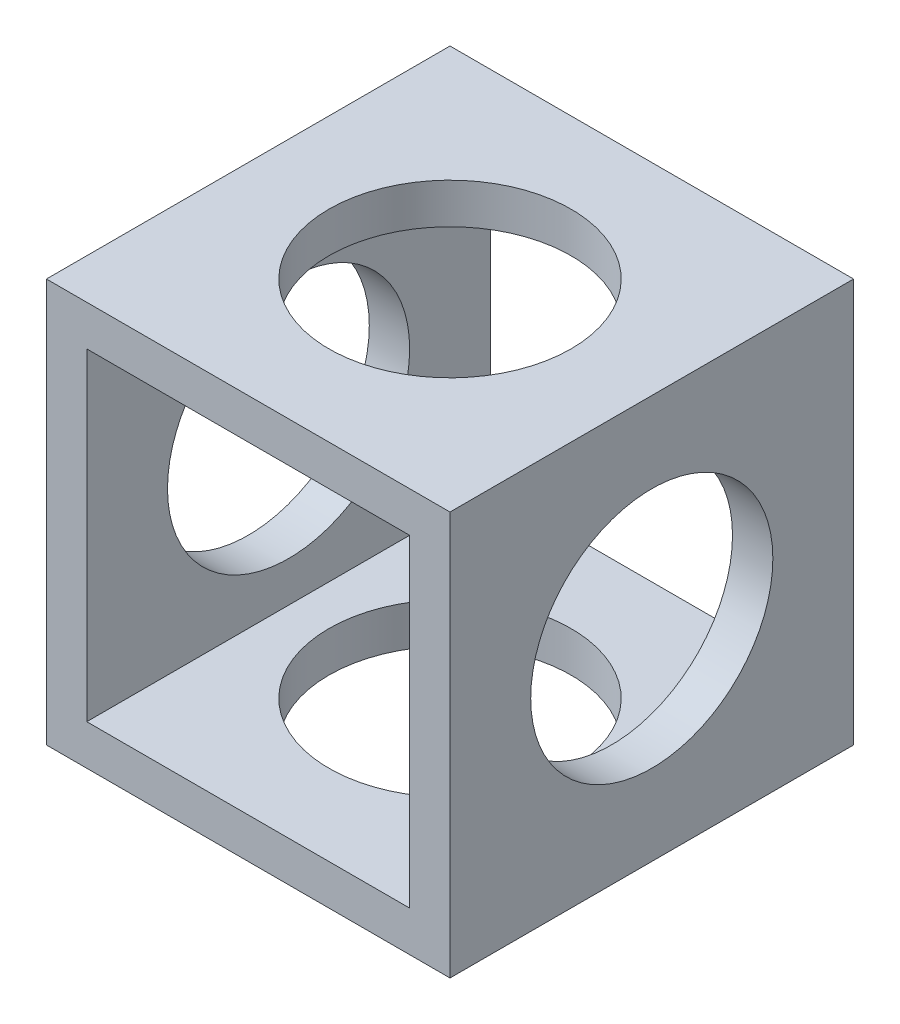
ISO-10303-21;
HEADER;
FILE_DESCRIPTION(('STEP AP214'),'2;1');
FILE_NAME('part.step','',(''),(''),'','','');
FILE_SCHEMA(('AUTOMOTIVE_DESIGN { 1 0 10303 214 1 1 1 1 }'));
ENDSEC;
DATA;
#1=APPLICATION_CONTEXT('core data for automotive mechanical design processes');
#2=APPLICATION_PROTOCOL_DEFINITION('international standard','automotive_design',2000,#1);
#3=PRODUCT_CONTEXT('',#1,'mechanical');
#4=PRODUCT('Part','Part','',(#3));
#5=PRODUCT_RELATED_PRODUCT_CATEGORY('part','',(#4));
#6=PRODUCT_DEFINITION_FORMATION('','',#4);
#7=PRODUCT_DEFINITION_CONTEXT('part definition',#1,'design');
#8=PRODUCT_DEFINITION('design','',#6,#7);
#9=PRODUCT_DEFINITION_SHAPE('','',#8);
#10=(LENGTH_UNIT() NAMED_UNIT(*) SI_UNIT(.MILLI.,.METRE.));
#11=(NAMED_UNIT(*) PLANE_ANGLE_UNIT() SI_UNIT($,.RADIAN.));
#12=(NAMED_UNIT(*) SI_UNIT($,.STERADIAN.) SOLID_ANGLE_UNIT());
#13=UNCERTAINTY_MEASURE_WITH_UNIT(LENGTH_MEASURE(1.E-05),#10,'distance_accuracy_value','');
#14=(GEOMETRIC_REPRESENTATION_CONTEXT(3) GLOBAL_UNCERTAINTY_ASSIGNED_CONTEXT((#13)) GLOBAL_UNIT_ASSIGNED_CONTEXT((#10,
#11,#12)) REPRESENTATION_CONTEXT('',''));
#15=CARTESIAN_POINT('',(0.,0.,0.));
#16=DIRECTION('',(0.,0.,1.));
#17=DIRECTION('',(1.,0.,0.));
#18=AXIS2_PLACEMENT_3D('',#15,#16,#17);
#19=CARTESIAN_POINT('',(-25.,-25.,-50.));
#20=DIRECTION('',(-1.,0.,0.));
#21=DIRECTION('',(0.,0.,1.));
#22=AXIS2_PLACEMENT_3D('',#19,#20,#21);
#23=PLANE('',#22);
#24=CARTESIAN_POINT('',(-25.,0.,-25.));
#25=DIRECTION('',(1.,0.,0.));
#26=DIRECTION('',(0.,0.,-1.));
#27=AXIS2_PLACEMENT_3D('',#24,#25,#26);
#28=CIRCLE('',#27,15.);
#29=CARTESIAN_POINT('',(-25.,0.,-40.));
#30=VERTEX_POINT('',#29);
#31=EDGE_CURVE('E220',#30,#30,#28,.T.);
#32=ORIENTED_EDGE('',*,*,#31,.T.);
#33=EDGE_LOOP('',(#32));
#34=FACE_BOUND('',#33,.T.);
#35=DIRECTION('',(0.,-1.,0.));
#36=VECTOR('',#35,1.);
#37=CARTESIAN_POINT('',(-25.,-25.,0.));
#38=LINE('',#37,#36);
#39=CARTESIAN_POINT('',(-25.,25.,0.));
#40=VERTEX_POINT('',#39);
#41=CARTESIAN_POINT('',(-25.,-25.,0.));
#42=VERTEX_POINT('',#41);
#43=EDGE_CURVE('E151',#40,#42,#38,.T.);
#44=ORIENTED_EDGE('',*,*,#43,.F.);
#45=DIRECTION('',(0.,0.,1.));
#46=VECTOR('',#45,1.);
#47=CARTESIAN_POINT('',(-25.,25.,-50.));
#48=LINE('',#47,#46);
#49=CARTESIAN_POINT('',(-25.,25.,-50.));
#50=VERTEX_POINT('',#49);
#51=EDGE_CURVE('E11',#50,#40,#48,.T.);
#52=ORIENTED_EDGE('',*,*,#51,.F.);
#53=DIRECTION('',(0.,-1.,0.));
#54=VECTOR('',#53,1.);
#55=CARTESIAN_POINT('',(-25.,-25.,-50.));
#56=LINE('',#55,#54);
#57=CARTESIAN_POINT('',(-25.,-25.,-50.));
#58=VERTEX_POINT('',#57);
#59=EDGE_CURVE('E157',#50,#58,#56,.T.);
#60=ORIENTED_EDGE('',*,*,#59,.T.);
#61=DIRECTION('',(0.,0.,1.));
#62=VECTOR('',#61,1.);
#63=CARTESIAN_POINT('',(-25.,-25.,-50.));
#64=LINE('',#63,#62);
#65=EDGE_CURVE('E174',#58,#42,#64,.T.);
#66=ORIENTED_EDGE('',*,*,#65,.T.);
#67=EDGE_LOOP('',(#44,#52,#60,#66));
#68=FACE_BOUND('',#67,.T.);
#69=ADVANCED_FACE('F39',(#34,#68),#23,.T.);
#70=CARTESIAN_POINT('',(25.,25.,-50.));
#71=DIRECTION('',(0.,1.,0.));
#72=DIRECTION('',(-1.,0.,0.));
#73=AXIS2_PLACEMENT_3D('',#70,#71,#72);
#74=PLANE('',#73);
#75=CARTESIAN_POINT('',(0.,25.,-25.));
#76=DIRECTION('',(0.,1.,0.));
#77=DIRECTION('',(-1.,0.,0.));
#78=AXIS2_PLACEMENT_3D('',#75,#76,#77);
#79=CIRCLE('',#78,15.);
#80=CARTESIAN_POINT('',(-15.,25.,-25.));
#81=VERTEX_POINT('',#80);
#82=EDGE_CURVE('E205',#81,#81,#79,.T.);
#83=ORIENTED_EDGE('',*,*,#82,.F.);
#84=EDGE_LOOP('',(#83));
#85=FACE_BOUND('',#84,.T.);
#86=DIRECTION('',(-1.,0.,0.));
#87=VECTOR('',#86,1.);
#88=CARTESIAN_POINT('',(25.,25.,0.));
#89=LINE('',#88,#87);
#90=CARTESIAN_POINT('',(25.,25.,0.));
#91=VERTEX_POINT('',#90);
#92=EDGE_CURVE('E162',#91,#40,#89,.T.);
#93=ORIENTED_EDGE('',*,*,#92,.F.);
#94=DIRECTION('',(0.,0.,1.));
#95=VECTOR('',#94,1.);
#96=CARTESIAN_POINT('',(25.,25.,-50.));
#97=LINE('',#96,#95);
#98=CARTESIAN_POINT('',(25.,25.,-50.));
#99=VERTEX_POINT('',#98);
#100=EDGE_CURVE('E48',#99,#91,#97,.T.);
#101=ORIENTED_EDGE('',*,*,#100,.F.);
#102=DIRECTION('',(-1.,0.,0.));
#103=VECTOR('',#102,1.);
#104=CARTESIAN_POINT('',(25.,25.,-50.));
#105=LINE('',#104,#103);
#106=EDGE_CURVE('E170',#99,#50,#105,.T.);
#107=ORIENTED_EDGE('',*,*,#106,.T.);
#108=ORIENTED_EDGE('',*,*,#51,.T.);
#109=EDGE_LOOP('',(#93,#101,#107,#108));
#110=FACE_BOUND('',#109,.T.);
#111=ADVANCED_FACE('F246',(#85,#110),#74,.T.);
#112=CARTESIAN_POINT('',(25.,-25.,-50.));
#113=DIRECTION('',(1.,0.,0.));
#114=DIRECTION('',(0.,0.,-1.));
#115=AXIS2_PLACEMENT_3D('',#112,#113,#114);
#116=PLANE('',#115);
#117=CARTESIAN_POINT('',(25.,0.,-25.));
#118=DIRECTION('',(1.,0.,0.));
#119=DIRECTION('',(0.,0.,-1.));
#120=AXIS2_PLACEMENT_3D('',#117,#118,#119);
#121=CIRCLE('',#120,15.);
#122=CARTESIAN_POINT('',(25.,0.,-40.));
#123=VERTEX_POINT('',#122);
#124=EDGE_CURVE('E216',#123,#123,#121,.T.);
#125=ORIENTED_EDGE('',*,*,#124,.F.);
#126=EDGE_LOOP('',(#125));
#127=FACE_BOUND('',#126,.T.);
#128=DIRECTION('',(0.,1.,0.));
#129=VECTOR('',#128,1.);
#130=CARTESIAN_POINT('',(25.,-25.,0.));
#131=LINE('',#130,#129);
#132=CARTESIAN_POINT('',(25.,-25.,0.));
#133=VERTEX_POINT('',#132);
#134=EDGE_CURVE('E182',#133,#91,#131,.T.);
#135=ORIENTED_EDGE('',*,*,#134,.F.);
#136=DIRECTION('',(0.,0.,1.));
#137=VECTOR('',#136,1.);
#138=CARTESIAN_POINT('',(25.,-25.,-50.));
#139=LINE('',#138,#137);
#140=CARTESIAN_POINT('',(25.,-25.,-50.));
#141=VERTEX_POINT('',#140);
#142=EDGE_CURVE('E191',#141,#133,#139,.T.);
#143=ORIENTED_EDGE('',*,*,#142,.F.);
#144=DIRECTION('',(0.,1.,0.));
#145=VECTOR('',#144,1.);
#146=CARTESIAN_POINT('',(25.,-25.,-50.));
#147=LINE('',#146,#145);
#148=EDGE_CURVE('E166',#141,#99,#147,.T.);
#149=ORIENTED_EDGE('',*,*,#148,.T.);
#150=ORIENTED_EDGE('',*,*,#100,.T.);
#151=EDGE_LOOP('',(#135,#143,#149,#150));
#152=FACE_BOUND('',#151,.T.);
#153=ADVANCED_FACE('F250',(#127,#152),#116,.T.);
#154=CARTESIAN_POINT('',(25.,-25.,-50.));
#155=DIRECTION('',(0.,-1.,0.));
#156=DIRECTION('',(1.,0.,0.));
#157=AXIS2_PLACEMENT_3D('',#154,#155,#156);
#158=PLANE('',#157);
#159=CARTESIAN_POINT('',(0.,-25.,-25.));
#160=DIRECTION('',(0.,1.,0.));
#161=DIRECTION('',(-1.,0.,0.));
#162=AXIS2_PLACEMENT_3D('',#159,#160,#161);
#163=CIRCLE('',#162,15.);
#164=CARTESIAN_POINT('',(-15.,-25.,-25.));
#165=VERTEX_POINT('',#164);
#166=EDGE_CURVE('E198',#165,#165,#163,.T.);
#167=ORIENTED_EDGE('',*,*,#166,.T.);
#168=EDGE_LOOP('',(#167));
#169=FACE_BOUND('',#168,.T.);
#170=DIRECTION('',(1.,0.,0.));
#171=VECTOR('',#170,1.);
#172=CARTESIAN_POINT('',(25.,-25.,0.));
#173=LINE('',#172,#171);
#174=EDGE_CURVE('E178',#42,#133,#173,.T.);
#175=ORIENTED_EDGE('',*,*,#174,.F.);
#176=ORIENTED_EDGE('',*,*,#65,.F.);
#177=DIRECTION('',(1.,0.,0.));
#178=VECTOR('',#177,1.);
#179=CARTESIAN_POINT('',(25.,-25.,-50.));
#180=LINE('',#179,#178);
#181=EDGE_CURVE('E161',#58,#141,#180,.T.);
#182=ORIENTED_EDGE('',*,*,#181,.T.);
#183=ORIENTED_EDGE('',*,*,#142,.T.);
#184=EDGE_LOOP('',(#175,#176,#182,#183));
#185=FACE_BOUND('',#184,.T.);
#186=ADVANCED_FACE('F266',(#169,#185),#158,.T.);
#187=CARTESIAN_POINT('',(0.,0.,-50.));
#188=DIRECTION('',(0.,0.,1.));
#189=DIRECTION('',(1.,0.,0.));
#190=AXIS2_PLACEMENT_3D('',#187,#188,#189);
#191=PLANE('',#190);
#192=DIRECTION('',(-1.,0.,0.));
#193=VECTOR('',#192,1.);
#194=CARTESIAN_POINT('',(20.,20.,-50.));
#195=LINE('',#194,#193);
#196=CARTESIAN_POINT('',(20.,20.,-50.));
#197=VERTEX_POINT('',#196);
#198=CARTESIAN_POINT('',(-20.,20.,-50.));
#199=VERTEX_POINT('',#198);
#200=EDGE_CURVE('E114',#197,#199,#195,.T.);
#201=ORIENTED_EDGE('',*,*,#200,.T.);
#202=DIRECTION('',(0.,-1.,0.));
#203=VECTOR('',#202,1.);
#204=CARTESIAN_POINT('',(-20.,-20.,-50.));
#205=LINE('',#204,#203);
#206=CARTESIAN_POINT('',(-20.,-20.,-50.));
#207=VERTEX_POINT('',#206);
#208=EDGE_CURVE('E107',#199,#207,#205,.T.);
#209=ORIENTED_EDGE('',*,*,#208,.T.);
#210=DIRECTION('',(1.,0.,0.));
#211=VECTOR('',#210,1.);
#212=CARTESIAN_POINT('',(20.,-20.,-50.));
#213=LINE('',#212,#211);
#214=CARTESIAN_POINT('',(20.,-20.,-50.));
#215=VERTEX_POINT('',#214);
#216=EDGE_CURVE('E117',#207,#215,#213,.T.);
#217=ORIENTED_EDGE('',*,*,#216,.T.);
#218=DIRECTION('',(0.,1.,0.));
#219=VECTOR('',#218,1.);
#220=CARTESIAN_POINT('',(20.,-20.,-50.));
#221=LINE('',#220,#219);
#222=EDGE_CURVE('E56',#215,#197,#221,.T.);
#223=ORIENTED_EDGE('',*,*,#222,.T.);
#224=EDGE_LOOP('',(#201,#209,#217,#223));
#225=FACE_BOUND('',#224,.T.);
#226=ORIENTED_EDGE('',*,*,#59,.F.);
#227=ORIENTED_EDGE('',*,*,#106,.F.);
#228=ORIENTED_EDGE('',*,*,#148,.F.);
#229=ORIENTED_EDGE('',*,*,#181,.F.);
#230=EDGE_LOOP('',(#226,#227,#228,#229));
#231=FACE_BOUND('',#230,.T.);
#232=ADVANCED_FACE('F122',(#225,#231),#191,.F.);
#233=CARTESIAN_POINT('',(0.,0.,0.));
#234=DIRECTION('',(0.,0.,1.));
#235=DIRECTION('',(1.,0.,0.));
#236=AXIS2_PLACEMENT_3D('',#233,#234,#235);
#237=PLANE('',#236);
#238=DIRECTION('',(0.,-1.,0.));
#239=VECTOR('',#238,1.);
#240=CARTESIAN_POINT('',(-20.,-20.,0.));
#241=LINE('',#240,#239);
#242=CARTESIAN_POINT('',(-20.,20.,0.));
#243=VERTEX_POINT('',#242);
#244=CARTESIAN_POINT('',(-20.,-20.,0.));
#245=VERTEX_POINT('',#244);
#246=EDGE_CURVE('E64',#243,#245,#241,.T.);
#247=ORIENTED_EDGE('',*,*,#246,.F.);
#248=DIRECTION('',(-1.,0.,0.));
#249=VECTOR('',#248,1.);
#250=CARTESIAN_POINT('',(20.,20.,0.));
#251=LINE('',#250,#249);
#252=CARTESIAN_POINT('',(20.,20.,0.));
#253=VERTEX_POINT('',#252);
#254=EDGE_CURVE('E126',#253,#243,#251,.T.);
#255=ORIENTED_EDGE('',*,*,#254,.F.);
#256=DIRECTION('',(0.,1.,0.));
#257=VECTOR('',#256,1.);
#258=CARTESIAN_POINT('',(20.,-20.,0.));
#259=LINE('',#258,#257);
#260=CARTESIAN_POINT('',(20.,-20.,0.));
#261=VERTEX_POINT('',#260);
#262=EDGE_CURVE('E130',#261,#253,#259,.T.);
#263=ORIENTED_EDGE('',*,*,#262,.F.);
#264=DIRECTION('',(1.,0.,0.));
#265=VECTOR('',#264,1.);
#266=CARTESIAN_POINT('',(20.,-20.,0.));
#267=LINE('',#266,#265);
#268=EDGE_CURVE('E142',#245,#261,#267,.T.);
#269=ORIENTED_EDGE('',*,*,#268,.F.);
#270=EDGE_LOOP('',(#247,#255,#263,#269));
#271=FACE_BOUND('',#270,.T.);
#272=ORIENTED_EDGE('',*,*,#43,.T.);
#273=ORIENTED_EDGE('',*,*,#174,.T.);
#274=ORIENTED_EDGE('',*,*,#134,.T.);
#275=ORIENTED_EDGE('',*,*,#92,.T.);
#276=EDGE_LOOP('',(#272,#273,#274,#275));
#277=FACE_BOUND('',#276,.T.);
#278=ADVANCED_FACE('F259',(#271,#277),#237,.T.);
#279=CARTESIAN_POINT('',(-20.,-20.,-50.));
#280=DIRECTION('',(-1.,0.,0.));
#281=DIRECTION('',(0.,0.,1.));
#282=AXIS2_PLACEMENT_3D('',#279,#280,#281);
#283=PLANE('',#282);
#284=CARTESIAN_POINT('',(-20.,0.,-25.));
#285=DIRECTION('',(-1.,0.,0.));
#286=DIRECTION('',(0.,0.,1.));
#287=AXIS2_PLACEMENT_3D('',#284,#285,#286);
#288=CIRCLE('',#287,15.);
#289=CARTESIAN_POINT('',(-20.,0.,-10.));
#290=VERTEX_POINT('',#289);
#291=EDGE_CURVE('E211',#290,#290,#288,.T.);
#292=ORIENTED_EDGE('',*,*,#291,.T.);
#293=EDGE_LOOP('',(#292));
#294=FACE_BOUND('',#293,.T.);
#295=ORIENTED_EDGE('',*,*,#246,.T.);
#296=DIRECTION('',(0.,0.,1.));
#297=VECTOR('',#296,1.);
#298=CARTESIAN_POINT('',(-20.,-20.,-50.));
#299=LINE('',#298,#297);
#300=EDGE_CURVE('E103',#207,#245,#299,.T.);
#301=ORIENTED_EDGE('',*,*,#300,.F.);
#302=ORIENTED_EDGE('',*,*,#208,.F.);
#303=DIRECTION('',(0.,0.,1.));
#304=VECTOR('',#303,1.);
#305=CARTESIAN_POINT('',(-20.,20.,-50.));
#306=LINE('',#305,#304);
#307=EDGE_CURVE('E148',#199,#243,#306,.T.);
#308=ORIENTED_EDGE('',*,*,#307,.T.);
#309=EDGE_LOOP('',(#295,#301,#302,#308));
#310=FACE_BOUND('',#309,.T.);
#311=ADVANCED_FACE('F105',(#294,#310),#283,.F.);
#312=CARTESIAN_POINT('',(20.,20.,-50.));
#313=DIRECTION('',(0.,1.,0.));
#314=DIRECTION('',(-1.,0.,0.));
#315=AXIS2_PLACEMENT_3D('',#312,#313,#314);
#316=PLANE('',#315);
#317=CARTESIAN_POINT('',(0.,20.,-25.));
#318=DIRECTION('',(0.,1.,0.));
#319=DIRECTION('',(-1.,0.,0.));
#320=AXIS2_PLACEMENT_3D('',#317,#318,#319);
#321=CIRCLE('',#320,15.);
#322=CARTESIAN_POINT('',(-15.,20.,-25.));
#323=VERTEX_POINT('',#322);
#324=EDGE_CURVE('E133',#323,#323,#321,.T.);
#325=ORIENTED_EDGE('',*,*,#324,.T.);
#326=EDGE_LOOP('',(#325));
#327=FACE_BOUND('',#326,.T.);
#328=ORIENTED_EDGE('',*,*,#254,.T.);
#329=ORIENTED_EDGE('',*,*,#307,.F.);
#330=ORIENTED_EDGE('',*,*,#200,.F.);
#331=DIRECTION('',(0.,0.,1.));
#332=VECTOR('',#331,1.);
#333=CARTESIAN_POINT('',(20.,20.,-50.));
#334=LINE('',#333,#332);
#335=EDGE_CURVE('E152',#197,#253,#334,.T.);
#336=ORIENTED_EDGE('',*,*,#335,.T.);
#337=EDGE_LOOP('',(#328,#329,#330,#336));
#338=FACE_BOUND('',#337,.T.);
#339=ADVANCED_FACE('F283',(#327,#338),#316,.F.);
#340=CARTESIAN_POINT('',(20.,-20.,-50.));
#341=DIRECTION('',(1.,0.,0.));
#342=DIRECTION('',(0.,0.,-1.));
#343=AXIS2_PLACEMENT_3D('',#340,#341,#342);
#344=PLANE('',#343);
#345=CARTESIAN_POINT('',(20.,0.,-25.));
#346=DIRECTION('',(1.,0.,0.));
#347=DIRECTION('',(0.,0.,-1.));
#348=AXIS2_PLACEMENT_3D('',#345,#346,#347);
#349=CIRCLE('',#348,15.);
#350=CARTESIAN_POINT('',(20.,0.,-40.));
#351=VERTEX_POINT('',#350);
#352=EDGE_CURVE('E42',#351,#351,#349,.T.);
#353=ORIENTED_EDGE('',*,*,#352,.T.);
#354=EDGE_LOOP('',(#353));
#355=FACE_BOUND('',#354,.T.);
#356=ORIENTED_EDGE('',*,*,#262,.T.);
#357=ORIENTED_EDGE('',*,*,#335,.F.);
#358=ORIENTED_EDGE('',*,*,#222,.F.);
#359=DIRECTION('',(0.,0.,1.));
#360=VECTOR('',#359,1.);
#361=CARTESIAN_POINT('',(20.,-20.,-50.));
#362=LINE('',#361,#360);
#363=EDGE_CURVE('E113',#215,#261,#362,.T.);
#364=ORIENTED_EDGE('',*,*,#363,.T.);
#365=EDGE_LOOP('',(#356,#357,#358,#364));
#366=FACE_BOUND('',#365,.T.);
#367=ADVANCED_FACE('F229',(#355,#366),#344,.F.);
#368=CARTESIAN_POINT('',(20.,-20.,-50.));
#369=DIRECTION('',(0.,-1.,0.));
#370=DIRECTION('',(1.,0.,0.));
#371=AXIS2_PLACEMENT_3D('',#368,#369,#370);
#372=PLANE('',#371);
#373=CARTESIAN_POINT('',(0.,-20.,-25.));
#374=DIRECTION('',(0.,-1.,0.));
#375=DIRECTION('',(1.,0.,0.));
#376=AXIS2_PLACEMENT_3D('',#373,#374,#375);
#377=CIRCLE('',#376,15.);
#378=CARTESIAN_POINT('',(15.,-20.,-25.));
#379=VERTEX_POINT('',#378);
#380=EDGE_CURVE('E195',#379,#379,#377,.T.);
#381=ORIENTED_EDGE('',*,*,#380,.T.);
#382=EDGE_LOOP('',(#381));
#383=FACE_BOUND('',#382,.T.);
#384=ORIENTED_EDGE('',*,*,#268,.T.);
#385=ORIENTED_EDGE('',*,*,#363,.F.);
#386=ORIENTED_EDGE('',*,*,#216,.F.);
#387=ORIENTED_EDGE('',*,*,#300,.T.);
#388=EDGE_LOOP('',(#384,#385,#386,#387));
#389=FACE_BOUND('',#388,.T.);
#390=ADVANCED_FACE('F118',(#383,#389),#372,.F.);
#391=CARTESIAN_POINT('',(0.,-25.,-25.));
#392=DIRECTION('',(0.,1.,0.));
#393=DIRECTION('',(-1.,0.,0.));
#394=AXIS2_PLACEMENT_3D('',#391,#392,#393);
#395=CYLINDRICAL_SURFACE('',#394,15.);
#396=ORIENTED_EDGE('',*,*,#166,.F.);
#397=EDGE_LOOP('',(#396));
#398=FACE_BOUND('',#397,.T.);
#399=ORIENTED_EDGE('',*,*,#380,.F.);
#400=EDGE_LOOP('',(#399));
#401=FACE_BOUND('',#400,.T.);
#402=ADVANCED_FACE('F242',(#398,#401),#395,.F.);
#403=ORIENTED_EDGE('',*,*,#82,.T.);
#404=EDGE_LOOP('',(#403));
#405=FACE_BOUND('',#404,.T.);
#406=ORIENTED_EDGE('',*,*,#324,.F.);
#407=EDGE_LOOP('',(#406));
#408=FACE_BOUND('',#407,.T.);
#409=ADVANCED_FACE('F234',(#405,#408),#395,.F.);
#410=CARTESIAN_POINT('',(-25.,0.,-25.));
#411=DIRECTION('',(1.,0.,0.));
#412=DIRECTION('',(0.,0.,-1.));
#413=AXIS2_PLACEMENT_3D('',#410,#411,#412);
#414=CYLINDRICAL_SURFACE('',#413,15.);
#415=ORIENTED_EDGE('',*,*,#124,.T.);
#416=EDGE_LOOP('',(#415));
#417=FACE_BOUND('',#416,.T.);
#418=ORIENTED_EDGE('',*,*,#352,.F.);
#419=EDGE_LOOP('',(#418));
#420=FACE_BOUND('',#419,.T.);
#421=ADVANCED_FACE('F231',(#417,#420),#414,.F.);
#422=ORIENTED_EDGE('',*,*,#31,.F.);
#423=EDGE_LOOP('',(#422));
#424=FACE_BOUND('',#423,.T.);
#425=ORIENTED_EDGE('',*,*,#291,.F.);
#426=EDGE_LOOP('',(#425));
#427=FACE_BOUND('',#426,.T.);
#428=ADVANCED_FACE('F233',(#424,#427),#414,.F.);
#429=CLOSED_SHELL('',(#69,#111,#153,#186,#232,#278,#311,#339,#367,#390,#402,#409,#421,#428));
#430=MANIFOLD_SOLID_BREP('B2',#429);
#431=ADVANCED_BREP_SHAPE_REPRESENTATION('',(#18,#430),#14);
#432=SHAPE_DEFINITION_REPRESENTATION(#9,#431);
ENDSEC;
END-ISO-10303-21;
